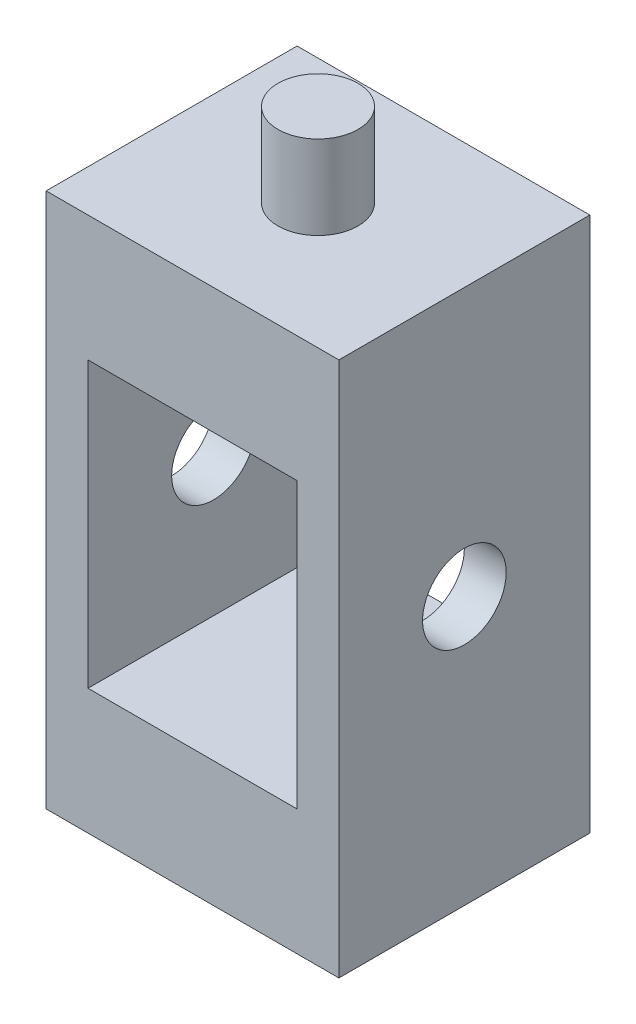
ISO-10303-21;
HEADER;
FILE_DESCRIPTION(('STEP AP214'),'2;1');
FILE_NAME('part.step','',(''),(''),'','','');
FILE_SCHEMA(('AUTOMOTIVE_DESIGN { 1 0 10303 214 1 1 1 1 }'));
ENDSEC;
DATA;
#1=APPLICATION_CONTEXT('core data for automotive mechanical design processes');
#2=APPLICATION_PROTOCOL_DEFINITION('international standard','automotive_design',2000,#1);
#3=PRODUCT_CONTEXT('',#1,'mechanical');
#4=PRODUCT('Part','Part','',(#3));
#5=PRODUCT_RELATED_PRODUCT_CATEGORY('part','',(#4));
#6=PRODUCT_DEFINITION_FORMATION('','',#4);
#7=PRODUCT_DEFINITION_CONTEXT('part definition',#1,'design');
#8=PRODUCT_DEFINITION('design','',#6,#7);
#9=PRODUCT_DEFINITION_SHAPE('','',#8);
#10=(LENGTH_UNIT() NAMED_UNIT(*) SI_UNIT(.MILLI.,.METRE.));
#11=(NAMED_UNIT(*) PLANE_ANGLE_UNIT() SI_UNIT($,.RADIAN.));
#12=(NAMED_UNIT(*) SI_UNIT($,.STERADIAN.) SOLID_ANGLE_UNIT());
#13=UNCERTAINTY_MEASURE_WITH_UNIT(LENGTH_MEASURE(1.E-05),#10,'distance_accuracy_value','');
#14=(GEOMETRIC_REPRESENTATION_CONTEXT(3) GLOBAL_UNCERTAINTY_ASSIGNED_CONTEXT((#13)) GLOBAL_UNIT_ASSIGNED_CONTEXT((#10,
#11,#12)) REPRESENTATION_CONTEXT('',''));
#15=CARTESIAN_POINT('',(0.,0.,0.));
#16=DIRECTION('',(0.,0.,1.));
#17=DIRECTION('',(1.,0.,0.));
#18=AXIS2_PLACEMENT_3D('',#15,#16,#17);
#19=CARTESIAN_POINT('',(12.5,-5.,15.));
#20=DIRECTION('',(1.,0.,0.));
#21=DIRECTION('',(0.,0.,-1.));
#22=AXIS2_PLACEMENT_3D('',#19,#20,#21);
#23=PLANE('',#22);
#24=DIRECTION('',(0.,0.,-1.));
#25=VECTOR('',#24,1.);
#26=CARTESIAN_POINT('',(12.5,-5.,15.));
#27=LINE('',#26,#25);
#28=CARTESIAN_POINT('',(12.5,-5.,15.));
#29=VERTEX_POINT('',#28);
#30=CARTESIAN_POINT('',(12.5,-5.,-15.));
#31=VERTEX_POINT('',#30);
#32=EDGE_CURVE('E215',#29,#31,#27,.T.);
#33=ORIENTED_EDGE('',*,*,#32,.F.);
#34=DIRECTION('',(0.,-1.,0.));
#35=VECTOR('',#34,1.);
#36=CARTESIAN_POINT('',(12.5,-5.,15.));
#37=LINE('',#36,#35);
#38=CARTESIAN_POINT('',(12.5,29.,15.));
#39=VERTEX_POINT('',#38);
#40=EDGE_CURVE('E97',#39,#29,#37,.T.);
#41=ORIENTED_EDGE('',*,*,#40,.F.);
#42=DIRECTION('',(0.,0.,-1.));
#43=VECTOR('',#42,1.);
#44=CARTESIAN_POINT('',(12.5,29.,15.));
#45=LINE('',#44,#43);
#46=CARTESIAN_POINT('',(12.5,29.,-15.));
#47=VERTEX_POINT('',#46);
#48=EDGE_CURVE('E154',#39,#47,#45,.T.);
#49=ORIENTED_EDGE('',*,*,#48,.T.);
#50=DIRECTION('',(0.,-1.,0.));
#51=VECTOR('',#50,1.);
#52=CARTESIAN_POINT('',(12.5,-5.,-15.));
#53=LINE('',#52,#51);
#54=EDGE_CURVE('E178',#47,#31,#53,.T.);
#55=ORIENTED_EDGE('',*,*,#54,.T.);
#56=EDGE_LOOP('',(#33,#41,#49,#55));
#57=FACE_BOUND('',#56,.T.);
#58=CARTESIAN_POINT('',(12.5,12.,0.));
#59=DIRECTION('',(1.,0.,0.));
#60=DIRECTION('',(0.,0.,-1.));
#61=AXIS2_PLACEMENT_3D('',#58,#59,#60);
#62=CIRCLE('',#61,5.);
#63=CARTESIAN_POINT('',(12.5,12.,-5.));
#64=VERTEX_POINT('',#63);
#65=EDGE_CURVE('E161',#64,#64,#62,.F.);
#66=ORIENTED_EDGE('',*,*,#65,.F.);
#67=EDGE_LOOP('',(#66));
#68=FACE_BOUND('',#67,.T.);
#69=ADVANCED_FACE('F41',(#57,#68),#23,.F.);
#70=CARTESIAN_POINT('',(-12.5,-5.,15.));
#71=DIRECTION('',(-1.,0.,0.));
#72=DIRECTION('',(0.,0.,1.));
#73=AXIS2_PLACEMENT_3D('',#70,#71,#72);
#74=PLANE('',#73);
#75=DIRECTION('',(0.,1.,0.));
#76=VECTOR('',#75,1.);
#77=CARTESIAN_POINT('',(-12.5,-5.,-15.));
#78=LINE('',#77,#76);
#79=CARTESIAN_POINT('',(-12.5,-5.,-15.));
#80=VERTEX_POINT('',#79);
#81=CARTESIAN_POINT('',(-12.5,29.,-15.));
#82=VERTEX_POINT('',#81);
#83=EDGE_CURVE('E197',#80,#82,#78,.T.);
#84=ORIENTED_EDGE('',*,*,#83,.T.);
#85=DIRECTION('',(0.,0.,-1.));
#86=VECTOR('',#85,1.);
#87=CARTESIAN_POINT('',(-12.5,29.,15.));
#88=LINE('',#87,#86);
#89=CARTESIAN_POINT('',(-12.5,29.,15.));
#90=VERTEX_POINT('',#89);
#91=EDGE_CURVE('E169',#90,#82,#88,.T.);
#92=ORIENTED_EDGE('',*,*,#91,.F.);
#93=DIRECTION('',(0.,1.,0.));
#94=VECTOR('',#93,1.);
#95=CARTESIAN_POINT('',(-12.5,-5.,15.));
#96=LINE('',#95,#94);
#97=CARTESIAN_POINT('',(-12.5,-5.,15.));
#98=VERTEX_POINT('',#97);
#99=EDGE_CURVE('E184',#98,#90,#96,.T.);
#100=ORIENTED_EDGE('',*,*,#99,.F.);
#101=DIRECTION('',(0.,0.,-1.));
#102=VECTOR('',#101,1.);
#103=CARTESIAN_POINT('',(-12.5,-5.,15.));
#104=LINE('',#103,#102);
#105=EDGE_CURVE('E211',#98,#80,#104,.T.);
#106=ORIENTED_EDGE('',*,*,#105,.T.);
#107=EDGE_LOOP('',(#84,#92,#100,#106));
#108=FACE_BOUND('',#107,.T.);
#109=CARTESIAN_POINT('',(-12.5,12.,0.));
#110=DIRECTION('',(-1.,0.,0.));
#111=DIRECTION('',(0.,0.,1.));
#112=AXIS2_PLACEMENT_3D('',#109,#110,#111);
#113=CIRCLE('',#112,5.);
#114=CARTESIAN_POINT('',(-12.5,12.,5.));
#115=VERTEX_POINT('',#114);
#116=EDGE_CURVE('E250',#115,#115,#113,.F.);
#117=ORIENTED_EDGE('',*,*,#116,.F.);
#118=EDGE_LOOP('',(#117));
#119=FACE_BOUND('',#118,.T.);
#120=ADVANCED_FACE('F237',(#108,#119),#74,.F.);
#121=CARTESIAN_POINT('',(-17.5,-20.,15.));
#122=DIRECTION('',(1.,0.,0.));
#123=DIRECTION('',(0.,0.,-1.));
#124=AXIS2_PLACEMENT_3D('',#121,#122,#123);
#125=PLANE('',#124);
#126=DIRECTION('',(0.,0.,-1.));
#127=VECTOR('',#126,1.);
#128=CARTESIAN_POINT('',(-17.5,-20.,15.));
#129=LINE('',#128,#127);
#130=CARTESIAN_POINT('',(-17.5,-20.,15.));
#131=VERTEX_POINT('',#130);
#132=CARTESIAN_POINT('',(-17.5,-20.,-15.));
#133=VERTEX_POINT('',#132);
#134=EDGE_CURVE('E208',#131,#133,#129,.T.);
#135=ORIENTED_EDGE('',*,*,#134,.F.);
#136=DIRECTION('',(0.,-1.,0.));
#137=VECTOR('',#136,1.);
#138=CARTESIAN_POINT('',(-17.5,-20.,15.));
#139=LINE('',#138,#137);
#140=CARTESIAN_POINT('',(-17.5,44.,15.));
#141=VERTEX_POINT('',#140);
#142=EDGE_CURVE('E187',#141,#131,#139,.T.);
#143=ORIENTED_EDGE('',*,*,#142,.F.);
#144=DIRECTION('',(0.,0.,-1.));
#145=VECTOR('',#144,1.);
#146=CARTESIAN_POINT('',(-17.5,44.,15.));
#147=LINE('',#146,#145);
#148=CARTESIAN_POINT('',(-17.5,44.,-15.));
#149=VERTEX_POINT('',#148);
#150=EDGE_CURVE('E146',#141,#149,#147,.T.);
#151=ORIENTED_EDGE('',*,*,#150,.T.);
#152=DIRECTION('',(0.,-1.,0.));
#153=VECTOR('',#152,1.);
#154=CARTESIAN_POINT('',(-17.5,-20.,-15.));
#155=LINE('',#154,#153);
#156=EDGE_CURVE('E82',#149,#133,#155,.T.);
#157=ORIENTED_EDGE('',*,*,#156,.T.);
#158=EDGE_LOOP('',(#135,#143,#151,#157));
#159=FACE_BOUND('',#158,.T.);
#160=CARTESIAN_POINT('',(-17.5,12.,0.));
#161=DIRECTION('',(-1.,0.,0.));
#162=DIRECTION('',(0.,0.,-1.));
#163=AXIS2_PLACEMENT_3D('',#160,#161,#162);
#164=CIRCLE('',#163,5.);
#165=CARTESIAN_POINT('',(-17.5,12.,-5.));
#166=VERTEX_POINT('',#165);
#167=EDGE_CURVE('E253',#166,#166,#164,.T.);
#168=ORIENTED_EDGE('',*,*,#167,.F.);
#169=EDGE_LOOP('',(#168));
#170=FACE_BOUND('',#169,.T.);
#171=ADVANCED_FACE('F233',(#159,#170),#125,.F.);
#172=CARTESIAN_POINT('',(17.5,-20.,15.));
#173=DIRECTION('',(-1.,0.,0.));
#174=DIRECTION('',(0.,0.,1.));
#175=AXIS2_PLACEMENT_3D('',#172,#173,#174);
#176=PLANE('',#175);
#177=DIRECTION('',(0.,1.,0.));
#178=VECTOR('',#177,1.);
#179=CARTESIAN_POINT('',(17.5,-20.,-15.));
#180=LINE('',#179,#178);
#181=CARTESIAN_POINT('',(17.5,-20.,-15.));
#182=VERTEX_POINT('',#181);
#183=CARTESIAN_POINT('',(17.5,44.,-15.));
#184=VERTEX_POINT('',#183);
#185=EDGE_CURVE('E140',#182,#184,#180,.T.);
#186=ORIENTED_EDGE('',*,*,#185,.T.);
#187=DIRECTION('',(0.,0.,-1.));
#188=VECTOR('',#187,1.);
#189=CARTESIAN_POINT('',(17.5,44.,15.));
#190=LINE('',#189,#188);
#191=CARTESIAN_POINT('',(17.5,44.,15.));
#192=VERTEX_POINT('',#191);
#193=EDGE_CURVE('E136',#192,#184,#190,.T.);
#194=ORIENTED_EDGE('',*,*,#193,.F.);
#195=DIRECTION('',(0.,1.,0.));
#196=VECTOR('',#195,1.);
#197=CARTESIAN_POINT('',(17.5,-20.,15.));
#198=LINE('',#197,#196);
#199=CARTESIAN_POINT('',(17.5,-20.,15.));
#200=VERTEX_POINT('',#199);
#201=EDGE_CURVE('E126',#200,#192,#198,.T.);
#202=ORIENTED_EDGE('',*,*,#201,.F.);
#203=DIRECTION('',(0.,0.,-1.));
#204=VECTOR('',#203,1.);
#205=CARTESIAN_POINT('',(17.5,-20.,15.));
#206=LINE('',#205,#204);
#207=EDGE_CURVE('E133',#200,#182,#206,.T.);
#208=ORIENTED_EDGE('',*,*,#207,.T.);
#209=EDGE_LOOP('',(#186,#194,#202,#208));
#210=FACE_BOUND('',#209,.T.);
#211=CARTESIAN_POINT('',(17.5,12.,0.));
#212=DIRECTION('',(-1.,0.,0.));
#213=DIRECTION('',(0.,0.,-1.));
#214=AXIS2_PLACEMENT_3D('',#211,#212,#213);
#215=CIRCLE('',#214,5.);
#216=CARTESIAN_POINT('',(17.5,12.,-5.));
#217=VERTEX_POINT('',#216);
#218=EDGE_CURVE('E258',#217,#217,#215,.T.);
#219=ORIENTED_EDGE('',*,*,#218,.T.);
#220=EDGE_LOOP('',(#219));
#221=FACE_BOUND('',#220,.T.);
#222=ADVANCED_FACE('F137',(#210,#221),#176,.F.);
#223=CARTESIAN_POINT('',(-17.5,-20.,15.));
#224=DIRECTION('',(0.,1.,0.));
#225=DIRECTION('',(0.,0.,1.));
#226=AXIS2_PLACEMENT_3D('',#223,#224,#225);
#227=PLANE('',#226);
#228=DIRECTION('',(1.,0.,0.));
#229=VECTOR('',#228,1.);
#230=CARTESIAN_POINT('',(-17.5,-20.,-15.));
#231=LINE('',#230,#229);
#232=EDGE_CURVE('E89',#133,#182,#231,.T.);
#233=ORIENTED_EDGE('',*,*,#232,.T.);
#234=ORIENTED_EDGE('',*,*,#207,.F.);
#235=DIRECTION('',(1.,0.,0.));
#236=VECTOR('',#235,1.);
#237=CARTESIAN_POINT('',(-17.5,-20.,15.));
#238=LINE('',#237,#236);
#239=EDGE_CURVE('E60',#131,#200,#238,.T.);
#240=ORIENTED_EDGE('',*,*,#239,.F.);
#241=ORIENTED_EDGE('',*,*,#134,.T.);
#242=EDGE_LOOP('',(#233,#234,#240,#241));
#243=FACE_BOUND('',#242,.T.);
#244=CARTESIAN_POINT('',(0.,-20.,0.));
#245=DIRECTION('',(0.,1.,0.));
#246=DIRECTION('',(0.,0.,1.));
#247=AXIS2_PLACEMENT_3D('',#244,#245,#246);
#248=CIRCLE('',#247,4.78108232900427);
#249=CARTESIAN_POINT('',(0.,-20.,4.78108232900427));
#250=VERTEX_POINT('',#249);
#251=EDGE_CURVE('E50',#250,#250,#248,.F.);
#252=ORIENTED_EDGE('',*,*,#251,.F.);
#253=EDGE_LOOP('',(#252));
#254=FACE_BOUND('',#253,.T.);
#255=ADVANCED_FACE('F224',(#243,#254),#227,.F.);
#256=CARTESIAN_POINT('',(-12.5,-5.,15.));
#257=DIRECTION('',(0.,-1.,0.));
#258=DIRECTION('',(0.,0.,-1.));
#259=AXIS2_PLACEMENT_3D('',#256,#257,#258);
#260=PLANE('',#259);
#261=DIRECTION('',(-1.,0.,0.));
#262=VECTOR('',#261,1.);
#263=CARTESIAN_POINT('',(-12.5,-5.,-15.));
#264=LINE('',#263,#262);
#265=EDGE_CURVE('E194',#31,#80,#264,.T.);
#266=ORIENTED_EDGE('',*,*,#265,.T.);
#267=ORIENTED_EDGE('',*,*,#105,.F.);
#268=DIRECTION('',(-1.,0.,0.));
#269=VECTOR('',#268,1.);
#270=CARTESIAN_POINT('',(-12.5,-5.,15.));
#271=LINE('',#270,#269);
#272=EDGE_CURVE('E181',#29,#98,#271,.T.);
#273=ORIENTED_EDGE('',*,*,#272,.F.);
#274=ORIENTED_EDGE('',*,*,#32,.T.);
#275=EDGE_LOOP('',(#266,#267,#273,#274));
#276=FACE_BOUND('',#275,.T.);
#277=ADVANCED_FACE('F226',(#276),#260,.F.);
#278=CARTESIAN_POINT('',(0.,0.,15.));
#279=DIRECTION('',(0.,0.,1.));
#280=DIRECTION('',(1.,0.,0.));
#281=AXIS2_PLACEMENT_3D('',#278,#279,#280);
#282=PLANE('',#281);
#283=DIRECTION('',(-1.,0.,0.));
#284=VECTOR('',#283,1.);
#285=CARTESIAN_POINT('',(-12.5,29.,15.));
#286=LINE('',#285,#284);
#287=EDGE_CURVE('E150',#39,#90,#286,.T.);
#288=ORIENTED_EDGE('',*,*,#287,.F.);
#289=ORIENTED_EDGE('',*,*,#40,.T.);
#290=ORIENTED_EDGE('',*,*,#272,.T.);
#291=ORIENTED_EDGE('',*,*,#99,.T.);
#292=EDGE_LOOP('',(#288,#289,#290,#291));
#293=FACE_BOUND('',#292,.T.);
#294=ORIENTED_EDGE('',*,*,#201,.T.);
#295=DIRECTION('',(1.,0.,0.));
#296=VECTOR('',#295,1.);
#297=CARTESIAN_POINT('',(-17.5,44.,15.));
#298=LINE('',#297,#296);
#299=EDGE_CURVE('E130',#141,#192,#298,.T.);
#300=ORIENTED_EDGE('',*,*,#299,.F.);
#301=ORIENTED_EDGE('',*,*,#142,.T.);
#302=ORIENTED_EDGE('',*,*,#239,.T.);
#303=EDGE_LOOP('',(#294,#300,#301,#302));
#304=FACE_BOUND('',#303,.T.);
#305=ADVANCED_FACE('F128',(#293,#304),#282,.T.);
#306=CARTESIAN_POINT('',(0.,0.,-15.));
#307=DIRECTION('',(0.,0.,1.));
#308=DIRECTION('',(1.,0.,0.));
#309=AXIS2_PLACEMENT_3D('',#306,#307,#308);
#310=PLANE('',#309);
#311=ORIENTED_EDGE('',*,*,#54,.F.);
#312=DIRECTION('',(-1.,0.,0.));
#313=VECTOR('',#312,1.);
#314=CARTESIAN_POINT('',(-12.5,29.,-15.));
#315=LINE('',#314,#313);
#316=EDGE_CURVE('E151',#47,#82,#315,.T.);
#317=ORIENTED_EDGE('',*,*,#316,.T.);
#318=ORIENTED_EDGE('',*,*,#83,.F.);
#319=ORIENTED_EDGE('',*,*,#265,.F.);
#320=EDGE_LOOP('',(#311,#317,#318,#319));
#321=FACE_BOUND('',#320,.T.);
#322=DIRECTION('',(1.,0.,0.));
#323=VECTOR('',#322,1.);
#324=CARTESIAN_POINT('',(-17.5,44.,-15.));
#325=LINE('',#324,#323);
#326=EDGE_CURVE('E158',#149,#184,#325,.T.);
#327=ORIENTED_EDGE('',*,*,#326,.T.);
#328=ORIENTED_EDGE('',*,*,#185,.F.);
#329=ORIENTED_EDGE('',*,*,#232,.F.);
#330=ORIENTED_EDGE('',*,*,#156,.F.);
#331=EDGE_LOOP('',(#327,#328,#329,#330));
#332=FACE_BOUND('',#331,.T.);
#333=ADVANCED_FACE('F298',(#321,#332),#310,.F.);
#334=CARTESIAN_POINT('',(0.,-30.,0.));
#335=DIRECTION('',(0.,1.,0.));
#336=DIRECTION('',(0.,0.,1.));
#337=AXIS2_PLACEMENT_3D('',#334,#335,#336);
#338=CYLINDRICAL_SURFACE('',#337,4.78108232900427);
#339=CARTESIAN_POINT('',(0.,-30.,0.));
#340=DIRECTION('',(0.,-1.,0.));
#341=DIRECTION('',(0.,0.,-1.));
#342=AXIS2_PLACEMENT_3D('',#339,#340,#341);
#343=CIRCLE('',#342,4.78108232900427);
#344=CARTESIAN_POINT('',(0.,-30.,-4.78108232900427));
#345=VERTEX_POINT('',#344);
#346=EDGE_CURVE('E145',#345,#345,#343,.T.);
#347=ORIENTED_EDGE('',*,*,#346,.F.);
#348=EDGE_LOOP('',(#347));
#349=FACE_BOUND('',#348,.T.);
#350=ORIENTED_EDGE('',*,*,#251,.T.);
#351=EDGE_LOOP('',(#350));
#352=FACE_BOUND('',#351,.T.);
#353=ADVANCED_FACE('F222',(#349,#352),#338,.T.);
#354=CARTESIAN_POINT('',(0.,-30.,0.));
#355=DIRECTION('',(0.,-1.,0.));
#356=DIRECTION('',(0.,0.,-1.));
#357=AXIS2_PLACEMENT_3D('',#354,#355,#356);
#358=PLANE('',#357);
#359=ORIENTED_EDGE('',*,*,#346,.T.);
#360=EDGE_LOOP('',(#359));
#361=FACE_BOUND('',#360,.T.);
#362=ADVANCED_FACE('F291',(#361),#358,.T.);
#363=CARTESIAN_POINT('',(-17.5,44.,15.));
#364=DIRECTION('',(0.,1.,0.));
#365=DIRECTION('',(0.,0.,1.));
#366=AXIS2_PLACEMENT_3D('',#363,#364,#365);
#367=PLANE('',#366);
#368=CARTESIAN_POINT('',(0.,44.,0.));
#369=DIRECTION('',(0.,1.,0.));
#370=DIRECTION('',(0.,0.,1.));
#371=AXIS2_PLACEMENT_3D('',#368,#369,#370);
#372=CIRCLE('',#371,4.78108232900427);
#373=CARTESIAN_POINT('',(0.,44.,4.78108232900427));
#374=VERTEX_POINT('',#373);
#375=EDGE_CURVE('E11',#374,#374,#372,.T.);
#376=ORIENTED_EDGE('',*,*,#375,.F.);
#377=EDGE_LOOP('',(#376));
#378=FACE_BOUND('',#377,.T.);
#379=ORIENTED_EDGE('',*,*,#326,.F.);
#380=ORIENTED_EDGE('',*,*,#150,.F.);
#381=ORIENTED_EDGE('',*,*,#299,.T.);
#382=ORIENTED_EDGE('',*,*,#193,.T.);
#383=EDGE_LOOP('',(#379,#380,#381,#382));
#384=FACE_BOUND('',#383,.T.);
#385=ADVANCED_FACE('F149',(#378,#384),#367,.T.);
#386=CARTESIAN_POINT('',(-12.5,29.,15.));
#387=DIRECTION('',(0.,-1.,0.));
#388=DIRECTION('',(0.,0.,-1.));
#389=AXIS2_PLACEMENT_3D('',#386,#387,#388);
#390=PLANE('',#389);
#391=ORIENTED_EDGE('',*,*,#316,.F.);
#392=ORIENTED_EDGE('',*,*,#48,.F.);
#393=ORIENTED_EDGE('',*,*,#287,.T.);
#394=ORIENTED_EDGE('',*,*,#91,.T.);
#395=EDGE_LOOP('',(#391,#392,#393,#394));
#396=FACE_BOUND('',#395,.T.);
#397=ADVANCED_FACE('F284',(#396),#390,.T.);
#398=CARTESIAN_POINT('',(-17.5,12.,0.));
#399=DIRECTION('',(1.,0.,0.));
#400=DIRECTION('',(0.,0.,-1.));
#401=AXIS2_PLACEMENT_3D('',#398,#399,#400);
#402=CYLINDRICAL_SURFACE('',#401,5.);
#403=ORIENTED_EDGE('',*,*,#218,.F.);
#404=EDGE_LOOP('',(#403));
#405=FACE_BOUND('',#404,.T.);
#406=ORIENTED_EDGE('',*,*,#65,.T.);
#407=EDGE_LOOP('',(#406));
#408=FACE_BOUND('',#407,.T.);
#409=ADVANCED_FACE('F281',(#405,#408),#402,.F.);
#410=ORIENTED_EDGE('',*,*,#167,.T.);
#411=EDGE_LOOP('',(#410));
#412=FACE_BOUND('',#411,.T.);
#413=ORIENTED_EDGE('',*,*,#116,.T.);
#414=EDGE_LOOP('',(#413));
#415=FACE_BOUND('',#414,.T.);
#416=ADVANCED_FACE('F278',(#412,#415),#402,.F.);
#417=CARTESIAN_POINT('',(0.,54.,0.));
#418=DIRECTION('',(0.,-1.,0.));
#419=DIRECTION('',(0.,0.,-1.));
#420=AXIS2_PLACEMENT_3D('',#417,#418,#419);
#421=CYLINDRICAL_SURFACE('',#420,4.78108232900427);
#422=CARTESIAN_POINT('',(0.,54.,0.));
#423=DIRECTION('',(0.,-1.,0.));
#424=DIRECTION('',(0.,0.,-1.));
#425=AXIS2_PLACEMENT_3D('',#422,#423,#424);
#426=CIRCLE('',#425,4.78108232900427);
#427=CARTESIAN_POINT('',(0.,54.,-4.78108232900427));
#428=VERTEX_POINT('',#427);
#429=EDGE_CURVE('E263',#428,#428,#426,.T.);
#430=ORIENTED_EDGE('',*,*,#429,.T.);
#431=EDGE_LOOP('',(#430));
#432=FACE_BOUND('',#431,.T.);
#433=ORIENTED_EDGE('',*,*,#375,.T.);
#434=EDGE_LOOP('',(#433));
#435=FACE_BOUND('',#434,.T.);
#436=ADVANCED_FACE('F269',(#432,#435),#421,.T.);
#437=CARTESIAN_POINT('',(0.,54.,0.));
#438=DIRECTION('',(0.,1.,0.));
#439=DIRECTION('',(0.,0.,-1.));
#440=AXIS2_PLACEMENT_3D('',#437,#438,#439);
#441=PLANE('',#440);
#442=ORIENTED_EDGE('',*,*,#429,.F.);
#443=EDGE_LOOP('',(#442));
#444=FACE_BOUND('',#443,.T.);
#445=ADVANCED_FACE('F272',(#444),#441,.T.);
#446=CLOSED_SHELL('',(#69,#120,#171,#222,#255,#277,#305,#333,#353,#362,#385,#397,#409,#416,#436,#445));
#447=MANIFOLD_SOLID_BREP('B2',#446);
#448=ADVANCED_BREP_SHAPE_REPRESENTATION('',(#18,#447),#14);
#449=SHAPE_DEFINITION_REPRESENTATION(#9,#448);
ENDSEC;
END-ISO-10303-21;
